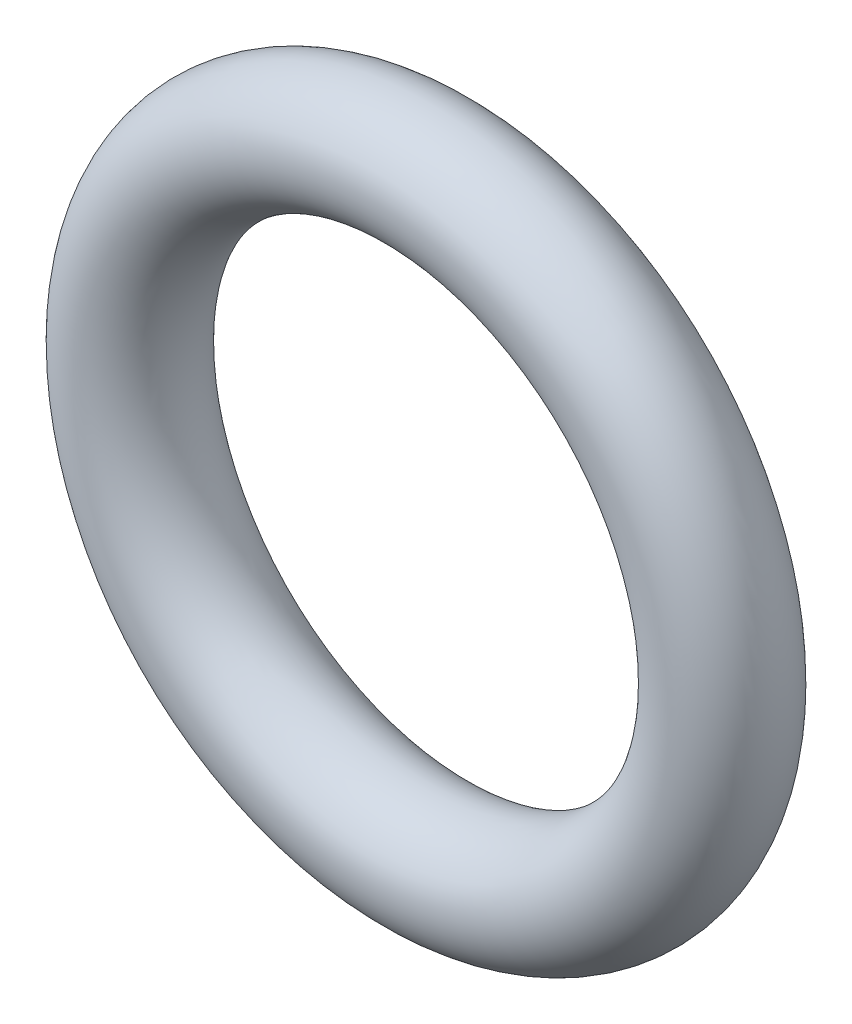
ISO-10303-21;
HEADER;
FILE_DESCRIPTION(('STEP AP214'),'2;1');
FILE_NAME('part.step','',(''),(''),'','','');
FILE_SCHEMA(('AUTOMOTIVE_DESIGN { 1 0 10303 214 1 1 1 1 }'));
ENDSEC;
DATA;
#1=APPLICATION_CONTEXT('core data for automotive mechanical design processes');
#2=APPLICATION_PROTOCOL_DEFINITION('international standard','automotive_design',2000,#1);
#3=PRODUCT_CONTEXT('',#1,'mechanical');
#4=PRODUCT('Part','Part','',(#3));
#5=PRODUCT_RELATED_PRODUCT_CATEGORY('part','',(#4));
#6=PRODUCT_DEFINITION_FORMATION('','',#4);
#7=PRODUCT_DEFINITION_CONTEXT('part definition',#1,'design');
#8=PRODUCT_DEFINITION('design','',#6,#7);
#9=PRODUCT_DEFINITION_SHAPE('','',#8);
#10=(LENGTH_UNIT() NAMED_UNIT(*) SI_UNIT(.MILLI.,.METRE.));
#11=(NAMED_UNIT(*) PLANE_ANGLE_UNIT() SI_UNIT($,.RADIAN.));
#12=(NAMED_UNIT(*) SI_UNIT($,.STERADIAN.) SOLID_ANGLE_UNIT());
#13=UNCERTAINTY_MEASURE_WITH_UNIT(LENGTH_MEASURE(1.E-05),#10,'distance_accuracy_value','');
#14=(GEOMETRIC_REPRESENTATION_CONTEXT(3) GLOBAL_UNCERTAINTY_ASSIGNED_CONTEXT((#13)) GLOBAL_UNIT_ASSIGNED_CONTEXT((#10,
#11,#12)) REPRESENTATION_CONTEXT('',''));
#15=CARTESIAN_POINT('',(0.,0.,0.));
#16=DIRECTION('',(0.,0.,1.));
#17=DIRECTION('',(1.,0.,0.));
#18=AXIS2_PLACEMENT_3D('',#15,#16,#17);
#19=CARTESIAN_POINT('',(0.,0.,0.));
#20=DIRECTION('',(0.,0.,1.));
#21=DIRECTION('',(1.,0.,0.));
#22=AXIS2_PLACEMENT_3D('',#19,#20,#21);
#23=TOROIDAL_SURFACE('',#22,5.,1.);
#24=CARTESIAN_POINT('',(6.,0.,0.));
#25=VERTEX_POINT('',#24);
#26=VERTEX_LOOP('',#25);
#27=FACE_BOUND('',#26,.T.);
#28=ADVANCED_FACE('F28',(#27),#23,.T.);
#29=CLOSED_SHELL('',(#28));
#30=MANIFOLD_SOLID_BREP('B2',#29);
#31=ADVANCED_BREP_SHAPE_REPRESENTATION('',(#18,#30),#14);
#32=SHAPE_DEFINITION_REPRESENTATION(#9,#31);
ENDSEC;
END-ISO-10303-21;
